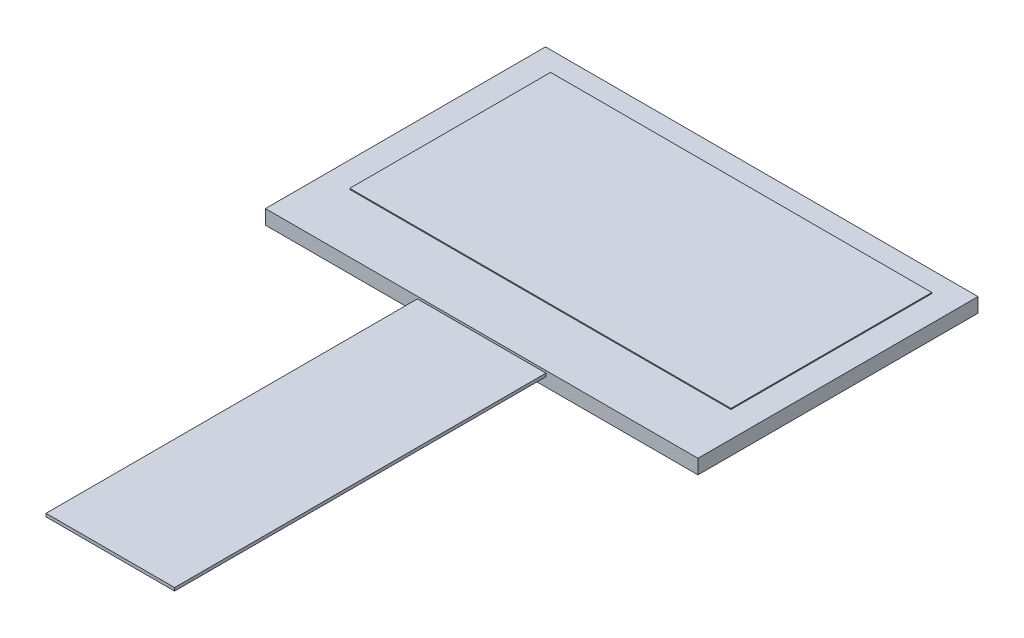
ISO-10303-21;
HEADER;
FILE_DESCRIPTION(('STEP AP214'),'2;1');
FILE_NAME('part.step','',(''),(''),'','','');
FILE_SCHEMA(('AUTOMOTIVE_DESIGN { 1 0 10303 214 1 1 1 1 }'));
ENDSEC;
DATA;
#1=APPLICATION_CONTEXT('core data for automotive mechanical design processes');
#2=APPLICATION_PROTOCOL_DEFINITION('international standard','automotive_design',2000,#1);
#3=PRODUCT_CONTEXT('',#1,'mechanical');
#4=PRODUCT('Part','Part','',(#3));
#5=PRODUCT_RELATED_PRODUCT_CATEGORY('part','',(#4));
#6=PRODUCT_DEFINITION_FORMATION('','',#4);
#7=PRODUCT_DEFINITION_CONTEXT('part definition',#1,'design');
#8=PRODUCT_DEFINITION('design','',#6,#7);
#9=PRODUCT_DEFINITION_SHAPE('','',#8);
#10=(LENGTH_UNIT() NAMED_UNIT(*) SI_UNIT(.MILLI.,.METRE.));
#11=(NAMED_UNIT(*) PLANE_ANGLE_UNIT() SI_UNIT($,.RADIAN.));
#12=(NAMED_UNIT(*) SI_UNIT($,.STERADIAN.) SOLID_ANGLE_UNIT());
#13=UNCERTAINTY_MEASURE_WITH_UNIT(LENGTH_MEASURE(1.E-05),#10,'distance_accuracy_value','');
#14=(GEOMETRIC_REPRESENTATION_CONTEXT(3) GLOBAL_UNCERTAINTY_ASSIGNED_CONTEXT((#13)) GLOBAL_UNIT_ASSIGNED_CONTEXT((#10,
#11,#12)) REPRESENTATION_CONTEXT('',''));
#15=CARTESIAN_POINT('',(0.,0.,0.));
#16=DIRECTION('',(0.,0.,1.));
#17=DIRECTION('',(1.,0.,0.));
#18=AXIS2_PLACEMENT_3D('',#15,#16,#17);
#19=CARTESIAN_POINT('',(21.02,1.4,13.61));
#20=DIRECTION('',(0.,0.,-1.));
#21=DIRECTION('',(-1.,0.,0.));
#22=AXIS2_PLACEMENT_3D('',#19,#20,#21);
#23=PLANE('',#22);
#24=DIRECTION('',(1.,0.,0.));
#25=VECTOR('',#24,1.);
#26=CARTESIAN_POINT('',(21.02,0.,13.61));
#27=LINE('',#26,#25);
#28=CARTESIAN_POINT('',(-21.02,0.,13.61));
#29=VERTEX_POINT('',#28);
#30=CARTESIAN_POINT('',(21.02,0.,13.61));
#31=VERTEX_POINT('',#30);
#32=EDGE_CURVE('E195',#29,#31,#27,.T.);
#33=ORIENTED_EDGE('',*,*,#32,.T.);
#34=DIRECTION('',(0.,-1.,0.));
#35=VECTOR('',#34,1.);
#36=CARTESIAN_POINT('',(21.02,1.4,13.61));
#37=LINE('',#36,#35);
#38=CARTESIAN_POINT('',(21.02,1.4,13.61));
#39=VERTEX_POINT('',#38);
#40=EDGE_CURVE('E45',#39,#31,#37,.T.);
#41=ORIENTED_EDGE('',*,*,#40,.F.);
#42=DIRECTION('',(1.,0.,0.));
#43=VECTOR('',#42,1.);
#44=CARTESIAN_POINT('',(21.02,1.4,13.61));
#45=LINE('',#44,#43);
#46=CARTESIAN_POINT('',(-21.02,1.4,13.61));
#47=VERTEX_POINT('',#46);
#48=EDGE_CURVE('E185',#47,#39,#45,.T.);
#49=ORIENTED_EDGE('',*,*,#48,.F.);
#50=DIRECTION('',(0.,-1.,0.));
#51=VECTOR('',#50,1.);
#52=CARTESIAN_POINT('',(-21.02,1.4,13.61));
#53=LINE('',#52,#51);
#54=EDGE_CURVE('E11',#47,#29,#53,.T.);
#55=ORIENTED_EDGE('',*,*,#54,.T.);
#56=EDGE_LOOP('',(#33,#41,#49,#55));
#57=FACE_BOUND('',#56,.T.);
#58=DIRECTION('',(0.,-1.,0.));
#59=VECTOR('',#58,1.);
#60=CARTESIAN_POINT('',(-6.25,1.18186060075836,13.61));
#61=LINE('',#60,#59);
#62=CARTESIAN_POINT('',(-6.25,1.18186060075836,13.61));
#63=VERTEX_POINT('',#62);
#64=CARTESIAN_POINT('',(-6.25,0.881860600758364,13.61));
#65=VERTEX_POINT('',#64);
#66=EDGE_CURVE('E146',#63,#65,#61,.T.);
#67=ORIENTED_EDGE('',*,*,#66,.F.);
#68=DIRECTION('',(-1.,0.,0.));
#69=VECTOR('',#68,1.);
#70=CARTESIAN_POINT('',(-6.25,1.18186060075836,13.61));
#71=LINE('',#70,#69);
#72=CARTESIAN_POINT('',(6.25,1.18186060075836,13.61));
#73=VERTEX_POINT('',#72);
#74=EDGE_CURVE('E143',#73,#63,#71,.T.);
#75=ORIENTED_EDGE('',*,*,#74,.F.);
#76=DIRECTION('',(0.,1.,0.));
#77=VECTOR('',#76,1.);
#78=CARTESIAN_POINT('',(6.25,1.18186060075836,13.61));
#79=LINE('',#78,#77);
#80=CARTESIAN_POINT('',(6.25,0.881860600758364,13.61));
#81=VERTEX_POINT('',#80);
#82=EDGE_CURVE('E57',#81,#73,#79,.T.);
#83=ORIENTED_EDGE('',*,*,#82,.F.);
#84=DIRECTION('',(1.,0.,0.));
#85=VECTOR('',#84,1.);
#86=CARTESIAN_POINT('',(-6.25,0.881860600758364,13.61));
#87=LINE('',#86,#85);
#88=EDGE_CURVE('E52',#65,#81,#87,.T.);
#89=ORIENTED_EDGE('',*,*,#88,.F.);
#90=EDGE_LOOP('',(#67,#75,#83,#89));
#91=FACE_BOUND('',#90,.T.);
#92=ADVANCED_FACE('F37',(#57,#91),#23,.F.);
#93=CARTESIAN_POINT('',(0.,1.4,0.));
#94=DIRECTION('',(0.,1.,0.));
#95=DIRECTION('',(0.,0.,1.));
#96=AXIS2_PLACEMENT_3D('',#93,#94,#95);
#97=PLANE('',#96);
#98=DIRECTION('',(0.,0.,1.));
#99=VECTOR('',#98,1.);
#100=CARTESIAN_POINT('',(-21.02,1.4,13.61));
#101=LINE('',#100,#99);
#102=CARTESIAN_POINT('',(-21.02,1.4,-13.61));
#103=VERTEX_POINT('',#102);
#104=EDGE_CURVE('E182',#103,#47,#101,.T.);
#105=ORIENTED_EDGE('',*,*,#104,.T.);
#106=ORIENTED_EDGE('',*,*,#48,.T.);
#107=DIRECTION('',(0.,0.,-1.));
#108=VECTOR('',#107,1.);
#109=CARTESIAN_POINT('',(21.02,1.4,13.61));
#110=LINE('',#109,#108);
#111=CARTESIAN_POINT('',(21.02,1.4,-13.61));
#112=VERTEX_POINT('',#111);
#113=EDGE_CURVE('E188',#39,#112,#110,.T.);
#114=ORIENTED_EDGE('',*,*,#113,.T.);
#115=DIRECTION('',(-1.,0.,0.));
#116=VECTOR('',#115,1.);
#117=CARTESIAN_POINT('',(21.02,1.4,-13.61));
#118=LINE('',#117,#116);
#119=EDGE_CURVE('E190',#112,#103,#118,.T.);
#120=ORIENTED_EDGE('',*,*,#119,.T.);
#121=EDGE_LOOP('',(#105,#106,#114,#120));
#122=FACE_BOUND('',#121,.T.);
#123=DIRECTION('',(1.,0.,0.));
#124=VECTOR('',#123,1.);
#125=CARTESIAN_POINT('',(-18.526,1.4,7.90599999999999));
#126=LINE('',#125,#124);
#127=CARTESIAN_POINT('',(-18.526,1.4,7.90599999999999));
#128=VERTEX_POINT('',#127);
#129=CARTESIAN_POINT('',(18.526,1.4,7.90599999999999));
#130=VERTEX_POINT('',#129);
#131=EDGE_CURVE('E150',#128,#130,#126,.T.);
#132=ORIENTED_EDGE('',*,*,#131,.F.);
#133=DIRECTION('',(0.,0.,1.));
#134=VECTOR('',#133,1.);
#135=CARTESIAN_POINT('',(-18.526,1.4,-11.61));
#136=LINE('',#135,#134);
#137=CARTESIAN_POINT('',(-18.526,1.4,-11.61));
#138=VERTEX_POINT('',#137);
#139=EDGE_CURVE('E147',#138,#128,#136,.T.);
#140=ORIENTED_EDGE('',*,*,#139,.F.);
#141=DIRECTION('',(-1.,0.,0.));
#142=VECTOR('',#141,1.);
#143=CARTESIAN_POINT('',(-18.526,1.4,-11.61));
#144=LINE('',#143,#142);
#145=CARTESIAN_POINT('',(18.526,1.4,-11.61));
#146=VERTEX_POINT('',#145);
#147=EDGE_CURVE('E160',#146,#138,#144,.T.);
#148=ORIENTED_EDGE('',*,*,#147,.F.);
#149=DIRECTION('',(0.,0.,-1.));
#150=VECTOR('',#149,1.);
#151=CARTESIAN_POINT('',(18.526,1.4,-11.61));
#152=LINE('',#151,#150);
#153=EDGE_CURVE('E168',#130,#146,#152,.T.);
#154=ORIENTED_EDGE('',*,*,#153,.F.);
#155=EDGE_LOOP('',(#132,#140,#148,#154));
#156=FACE_BOUND('',#155,.T.);
#157=ADVANCED_FACE('F224',(#122,#156),#97,.T.);
#158=CARTESIAN_POINT('',(-21.02,1.4,13.61));
#159=DIRECTION('',(1.,0.,0.));
#160=DIRECTION('',(0.,0.,-1.));
#161=AXIS2_PLACEMENT_3D('',#158,#159,#160);
#162=PLANE('',#161);
#163=DIRECTION('',(0.,0.,1.));
#164=VECTOR('',#163,1.);
#165=CARTESIAN_POINT('',(-21.02,0.,13.61));
#166=LINE('',#165,#164);
#167=CARTESIAN_POINT('',(-21.02,0.,-13.61));
#168=VERTEX_POINT('',#167);
#169=EDGE_CURVE('E181',#168,#29,#166,.T.);
#170=ORIENTED_EDGE('',*,*,#169,.T.);
#171=ORIENTED_EDGE('',*,*,#54,.F.);
#172=ORIENTED_EDGE('',*,*,#104,.F.);
#173=DIRECTION('',(0.,-1.,0.));
#174=VECTOR('',#173,1.);
#175=CARTESIAN_POINT('',(-21.02,1.4,-13.61));
#176=LINE('',#175,#174);
#177=EDGE_CURVE('E192',#103,#168,#176,.T.);
#178=ORIENTED_EDGE('',*,*,#177,.T.);
#179=EDGE_LOOP('',(#170,#171,#172,#178));
#180=FACE_BOUND('',#179,.T.);
#181=ADVANCED_FACE('F39',(#180),#162,.F.);
#182=CARTESIAN_POINT('',(21.02,1.4,13.61));
#183=DIRECTION('',(-1.,0.,0.));
#184=DIRECTION('',(0.,0.,1.));
#185=AXIS2_PLACEMENT_3D('',#182,#183,#184);
#186=PLANE('',#185);
#187=DIRECTION('',(0.,0.,-1.));
#188=VECTOR('',#187,1.);
#189=CARTESIAN_POINT('',(21.02,0.,13.61));
#190=LINE('',#189,#188);
#191=CARTESIAN_POINT('',(21.02,0.,-13.61));
#192=VERTEX_POINT('',#191);
#193=EDGE_CURVE('E197',#31,#192,#190,.T.);
#194=ORIENTED_EDGE('',*,*,#193,.T.);
#195=DIRECTION('',(0.,-1.,0.));
#196=VECTOR('',#195,1.);
#197=CARTESIAN_POINT('',(21.02,1.4,-13.61));
#198=LINE('',#197,#196);
#199=EDGE_CURVE('E202',#112,#192,#198,.T.);
#200=ORIENTED_EDGE('',*,*,#199,.F.);
#201=ORIENTED_EDGE('',*,*,#113,.F.);
#202=ORIENTED_EDGE('',*,*,#40,.T.);
#203=EDGE_LOOP('',(#194,#200,#201,#202));
#204=FACE_BOUND('',#203,.T.);
#205=ADVANCED_FACE('F209',(#204),#186,.F.);
#206=CARTESIAN_POINT('',(21.02,1.4,-13.61));
#207=DIRECTION('',(0.,0.,1.));
#208=DIRECTION('',(1.,0.,0.));
#209=AXIS2_PLACEMENT_3D('',#206,#207,#208);
#210=PLANE('',#209);
#211=DIRECTION('',(-1.,0.,0.));
#212=VECTOR('',#211,1.);
#213=CARTESIAN_POINT('',(21.02,0.,-13.61));
#214=LINE('',#213,#212);
#215=EDGE_CURVE('E186',#192,#168,#214,.T.);
#216=ORIENTED_EDGE('',*,*,#215,.T.);
#217=ORIENTED_EDGE('',*,*,#177,.F.);
#218=ORIENTED_EDGE('',*,*,#119,.F.);
#219=ORIENTED_EDGE('',*,*,#199,.T.);
#220=EDGE_LOOP('',(#216,#217,#218,#219));
#221=FACE_BOUND('',#220,.T.);
#222=ADVANCED_FACE('F218',(#221),#210,.F.);
#223=CARTESIAN_POINT('',(0.,0.,0.));
#224=DIRECTION('',(0.,1.,0.));
#225=DIRECTION('',(0.,0.,1.));
#226=AXIS2_PLACEMENT_3D('',#223,#224,#225);
#227=PLANE('',#226);
#228=ORIENTED_EDGE('',*,*,#169,.F.);
#229=ORIENTED_EDGE('',*,*,#215,.F.);
#230=ORIENTED_EDGE('',*,*,#193,.F.);
#231=ORIENTED_EDGE('',*,*,#32,.F.);
#232=EDGE_LOOP('',(#228,#229,#230,#231));
#233=FACE_BOUND('',#232,.T.);
#234=ADVANCED_FACE('F215',(#233),#227,.F.);
#235=CARTESIAN_POINT('',(-18.526,1.5,-11.61));
#236=DIRECTION('',(1.,0.,0.));
#237=DIRECTION('',(0.,0.,-1.));
#238=AXIS2_PLACEMENT_3D('',#235,#236,#237);
#239=PLANE('',#238);
#240=ORIENTED_EDGE('',*,*,#139,.T.);
#241=DIRECTION('',(0.,-1.,0.));
#242=VECTOR('',#241,1.);
#243=CARTESIAN_POINT('',(-18.526,1.5,7.90599999999999));
#244=LINE('',#243,#242);
#245=CARTESIAN_POINT('',(-18.526,1.5,7.90599999999999));
#246=VERTEX_POINT('',#245);
#247=EDGE_CURVE('E179',#246,#128,#244,.T.);
#248=ORIENTED_EDGE('',*,*,#247,.F.);
#249=DIRECTION('',(0.,0.,1.));
#250=VECTOR('',#249,1.);
#251=CARTESIAN_POINT('',(-18.526,1.5,-11.61));
#252=LINE('',#251,#250);
#253=CARTESIAN_POINT('',(-18.526,1.5,-11.61));
#254=VERTEX_POINT('',#253);
#255=EDGE_CURVE('E156',#254,#246,#252,.T.);
#256=ORIENTED_EDGE('',*,*,#255,.F.);
#257=DIRECTION('',(0.,-1.,0.));
#258=VECTOR('',#257,1.);
#259=CARTESIAN_POINT('',(-18.526,1.5,-11.61));
#260=LINE('',#259,#258);
#261=EDGE_CURVE('E165',#254,#138,#260,.T.);
#262=ORIENTED_EDGE('',*,*,#261,.T.);
#263=EDGE_LOOP('',(#240,#248,#256,#262));
#264=FACE_BOUND('',#263,.T.);
#265=ADVANCED_FACE('F269',(#264),#239,.F.);
#266=CARTESIAN_POINT('',(-18.526,1.5,7.90599999999999));
#267=DIRECTION('',(0.,0.,-1.));
#268=DIRECTION('',(-1.,0.,0.));
#269=AXIS2_PLACEMENT_3D('',#266,#267,#268);
#270=PLANE('',#269);
#271=ORIENTED_EDGE('',*,*,#131,.T.);
#272=DIRECTION('',(0.,-1.,0.));
#273=VECTOR('',#272,1.);
#274=CARTESIAN_POINT('',(18.526,1.5,7.90599999999999));
#275=LINE('',#274,#273);
#276=CARTESIAN_POINT('',(18.526,1.5,7.90599999999999));
#277=VERTEX_POINT('',#276);
#278=EDGE_CURVE('E176',#277,#130,#275,.T.);
#279=ORIENTED_EDGE('',*,*,#278,.F.);
#280=DIRECTION('',(1.,0.,0.));
#281=VECTOR('',#280,1.);
#282=CARTESIAN_POINT('',(-18.526,1.5,7.90599999999999));
#283=LINE('',#282,#281);
#284=EDGE_CURVE('E159',#246,#277,#283,.T.);
#285=ORIENTED_EDGE('',*,*,#284,.F.);
#286=ORIENTED_EDGE('',*,*,#247,.T.);
#287=EDGE_LOOP('',(#271,#279,#285,#286));
#288=FACE_BOUND('',#287,.T.);
#289=ADVANCED_FACE('F265',(#288),#270,.F.);
#290=CARTESIAN_POINT('',(18.526,1.5,-11.61));
#291=DIRECTION('',(-1.,0.,0.));
#292=DIRECTION('',(0.,0.,1.));
#293=AXIS2_PLACEMENT_3D('',#290,#291,#292);
#294=PLANE('',#293);
#295=ORIENTED_EDGE('',*,*,#153,.T.);
#296=DIRECTION('',(0.,-1.,0.));
#297=VECTOR('',#296,1.);
#298=CARTESIAN_POINT('',(18.526,1.5,-11.61));
#299=LINE('',#298,#297);
#300=CARTESIAN_POINT('',(18.526,1.5,-11.61));
#301=VERTEX_POINT('',#300);
#302=EDGE_CURVE('E174',#301,#146,#299,.T.);
#303=ORIENTED_EDGE('',*,*,#302,.F.);
#304=DIRECTION('',(0.,0.,-1.));
#305=VECTOR('',#304,1.);
#306=CARTESIAN_POINT('',(18.526,1.5,-11.61));
#307=LINE('',#306,#305);
#308=EDGE_CURVE('E162',#277,#301,#307,.T.);
#309=ORIENTED_EDGE('',*,*,#308,.F.);
#310=ORIENTED_EDGE('',*,*,#278,.T.);
#311=EDGE_LOOP('',(#295,#303,#309,#310));
#312=FACE_BOUND('',#311,.T.);
#313=ADVANCED_FACE('F261',(#312),#294,.F.);
#314=CARTESIAN_POINT('',(-18.526,1.5,-11.61));
#315=DIRECTION('',(0.,0.,1.));
#316=DIRECTION('',(1.,0.,0.));
#317=AXIS2_PLACEMENT_3D('',#314,#315,#316);
#318=PLANE('',#317);
#319=ORIENTED_EDGE('',*,*,#147,.T.);
#320=ORIENTED_EDGE('',*,*,#261,.F.);
#321=DIRECTION('',(-1.,0.,0.));
#322=VECTOR('',#321,1.);
#323=CARTESIAN_POINT('',(-18.526,1.5,-11.61));
#324=LINE('',#323,#322);
#325=EDGE_CURVE('E164',#301,#254,#324,.T.);
#326=ORIENTED_EDGE('',*,*,#325,.F.);
#327=ORIENTED_EDGE('',*,*,#302,.T.);
#328=EDGE_LOOP('',(#319,#320,#326,#327));
#329=FACE_BOUND('',#328,.T.);
#330=ADVANCED_FACE('F257',(#329),#318,.F.);
#331=CARTESIAN_POINT('',(0.,1.5,0.));
#332=DIRECTION('',(0.,1.,0.));
#333=DIRECTION('',(0.,0.,1.));
#334=AXIS2_PLACEMENT_3D('',#331,#332,#333);
#335=PLANE('',#334);
#336=ORIENTED_EDGE('',*,*,#255,.T.);
#337=ORIENTED_EDGE('',*,*,#284,.T.);
#338=ORIENTED_EDGE('',*,*,#308,.T.);
#339=ORIENTED_EDGE('',*,*,#325,.T.);
#340=EDGE_LOOP('',(#336,#337,#338,#339));
#341=FACE_BOUND('',#340,.T.);
#342=ADVANCED_FACE('F254',(#341),#335,.T.);
#343=CARTESIAN_POINT('',(-6.25,1.18186060075836,49.71));
#344=DIRECTION('',(1.,0.,0.));
#345=DIRECTION('',(0.,0.,-1.));
#346=AXIS2_PLACEMENT_3D('',#343,#344,#345);
#347=PLANE('',#346);
#348=ORIENTED_EDGE('',*,*,#66,.T.);
#349=DIRECTION('',(0.,0.,-1.));
#350=VECTOR('',#349,1.);
#351=CARTESIAN_POINT('',(-6.25,0.881860600758364,49.71));
#352=LINE('',#351,#350);
#353=CARTESIAN_POINT('',(-6.25,0.881860600758364,49.71));
#354=VERTEX_POINT('',#353);
#355=EDGE_CURVE('E127',#354,#65,#352,.T.);
#356=ORIENTED_EDGE('',*,*,#355,.F.);
#357=DIRECTION('',(0.,-1.,0.));
#358=VECTOR('',#357,1.);
#359=CARTESIAN_POINT('',(-6.25,1.18186060075836,49.71));
#360=LINE('',#359,#358);
#361=CARTESIAN_POINT('',(-6.25,1.18186060075836,49.71));
#362=VERTEX_POINT('',#361);
#363=EDGE_CURVE('E134',#362,#354,#360,.T.);
#364=ORIENTED_EDGE('',*,*,#363,.F.);
#365=DIRECTION('',(0.,0.,-1.));
#366=VECTOR('',#365,1.);
#367=CARTESIAN_POINT('',(-6.25,1.18186060075836,49.71));
#368=LINE('',#367,#366);
#369=EDGE_CURVE('E232',#362,#63,#368,.T.);
#370=ORIENTED_EDGE('',*,*,#369,.T.);
#371=EDGE_LOOP('',(#348,#356,#364,#370));
#372=FACE_BOUND('',#371,.T.);
#373=ADVANCED_FACE('F145',(#372),#347,.F.);
#374=CARTESIAN_POINT('',(-6.25,0.881860600758364,49.71));
#375=DIRECTION('',(0.,1.,0.));
#376=DIRECTION('',(-1.,0.,0.));
#377=AXIS2_PLACEMENT_3D('',#374,#375,#376);
#378=PLANE('',#377);
#379=ORIENTED_EDGE('',*,*,#88,.T.);
#380=DIRECTION('',(0.,0.,-1.));
#381=VECTOR('',#380,1.);
#382=CARTESIAN_POINT('',(6.25,0.881860600758364,49.71));
#383=LINE('',#382,#381);
#384=CARTESIAN_POINT('',(6.25,0.881860600758364,49.71));
#385=VERTEX_POINT('',#384);
#386=EDGE_CURVE('E130',#385,#81,#383,.T.);
#387=ORIENTED_EDGE('',*,*,#386,.F.);
#388=DIRECTION('',(1.,0.,0.));
#389=VECTOR('',#388,1.);
#390=CARTESIAN_POINT('',(-6.25,0.881860600758364,49.71));
#391=LINE('',#390,#389);
#392=EDGE_CURVE('E123',#354,#385,#391,.T.);
#393=ORIENTED_EDGE('',*,*,#392,.F.);
#394=ORIENTED_EDGE('',*,*,#355,.T.);
#395=EDGE_LOOP('',(#379,#387,#393,#394));
#396=FACE_BOUND('',#395,.T.);
#397=ADVANCED_FACE('F125',(#396),#378,.F.);
#398=CARTESIAN_POINT('',(6.25,1.18186060075836,49.71));
#399=DIRECTION('',(-1.,0.,0.));
#400=DIRECTION('',(0.,0.,1.));
#401=AXIS2_PLACEMENT_3D('',#398,#399,#400);
#402=PLANE('',#401);
#403=ORIENTED_EDGE('',*,*,#82,.T.);
#404=DIRECTION('',(0.,0.,-1.));
#405=VECTOR('',#404,1.);
#406=CARTESIAN_POINT('',(6.25,1.18186060075836,49.71));
#407=LINE('',#406,#405);
#408=CARTESIAN_POINT('',(6.25,1.18186060075836,49.71));
#409=VERTEX_POINT('',#408);
#410=EDGE_CURVE('E152',#409,#73,#407,.T.);
#411=ORIENTED_EDGE('',*,*,#410,.F.);
#412=DIRECTION('',(0.,1.,0.));
#413=VECTOR('',#412,1.);
#414=CARTESIAN_POINT('',(6.25,1.18186060075836,49.71));
#415=LINE('',#414,#413);
#416=EDGE_CURVE('E133',#385,#409,#415,.T.);
#417=ORIENTED_EDGE('',*,*,#416,.F.);
#418=ORIENTED_EDGE('',*,*,#386,.T.);
#419=EDGE_LOOP('',(#403,#411,#417,#418));
#420=FACE_BOUND('',#419,.T.);
#421=ADVANCED_FACE('F241',(#420),#402,.F.);
#422=CARTESIAN_POINT('',(-6.25,1.18186060075836,49.71));
#423=DIRECTION('',(0.,-1.,0.));
#424=DIRECTION('',(0.,0.,-1.));
#425=AXIS2_PLACEMENT_3D('',#422,#423,#424);
#426=PLANE('',#425);
#427=ORIENTED_EDGE('',*,*,#74,.T.);
#428=ORIENTED_EDGE('',*,*,#369,.F.);
#429=DIRECTION('',(-1.,0.,0.));
#430=VECTOR('',#429,1.);
#431=CARTESIAN_POINT('',(-6.25,1.18186060075836,49.71));
#432=LINE('',#431,#430);
#433=EDGE_CURVE('E139',#409,#362,#432,.T.);
#434=ORIENTED_EDGE('',*,*,#433,.F.);
#435=ORIENTED_EDGE('',*,*,#410,.T.);
#436=EDGE_LOOP('',(#427,#428,#434,#435));
#437=FACE_BOUND('',#436,.T.);
#438=ADVANCED_FACE('F231',(#437),#426,.F.);
#439=CARTESIAN_POINT('',(0.,0.,49.71));
#440=DIRECTION('',(0.,0.,1.));
#441=DIRECTION('',(1.,0.,0.));
#442=AXIS2_PLACEMENT_3D('',#439,#440,#441);
#443=PLANE('',#442);
#444=ORIENTED_EDGE('',*,*,#363,.T.);
#445=ORIENTED_EDGE('',*,*,#392,.T.);
#446=ORIENTED_EDGE('',*,*,#416,.T.);
#447=ORIENTED_EDGE('',*,*,#433,.T.);
#448=EDGE_LOOP('',(#444,#445,#446,#447));
#449=FACE_BOUND('',#448,.T.);
#450=ADVANCED_FACE('F137',(#449),#443,.T.);
#451=CLOSED_SHELL('',(#92,#157,#181,#205,#222,#234,#265,#289,#313,#330,#342,#373,#397,#421,#438,#450));
#452=MANIFOLD_SOLID_BREP('B2',#451);
#453=ADVANCED_BREP_SHAPE_REPRESENTATION('',(#18,#452),#14);
#454=SHAPE_DEFINITION_REPRESENTATION(#9,#453);
ENDSEC;
END-ISO-10303-21;
